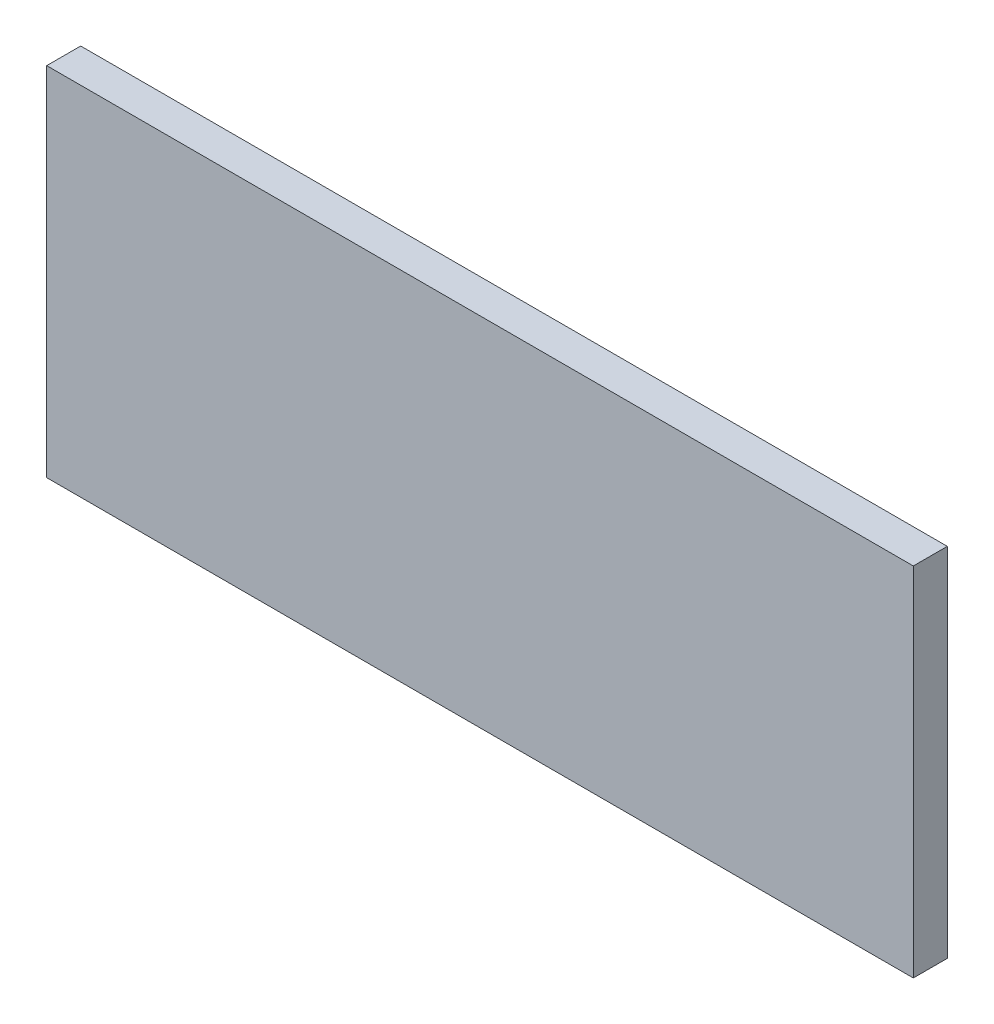
ISO-10303-21;
HEADER;
FILE_DESCRIPTION(('STEP AP214'),'2;1');
FILE_NAME('part.step','',(''),(''),'','','');
FILE_SCHEMA(('AUTOMOTIVE_DESIGN { 1 0 10303 214 1 1 1 1 }'));
ENDSEC;
DATA;
#1=APPLICATION_CONTEXT('core data for automotive mechanical design processes');
#2=APPLICATION_PROTOCOL_DEFINITION('international standard','automotive_design',2000,#1);
#3=PRODUCT_CONTEXT('',#1,'mechanical');
#4=PRODUCT('Part','Part','',(#3));
#5=PRODUCT_RELATED_PRODUCT_CATEGORY('part','',(#4));
#6=PRODUCT_DEFINITION_FORMATION('','',#4);
#7=PRODUCT_DEFINITION_CONTEXT('part definition',#1,'design');
#8=PRODUCT_DEFINITION('design','',#6,#7);
#9=PRODUCT_DEFINITION_SHAPE('','',#8);
#10=(LENGTH_UNIT() NAMED_UNIT(*) SI_UNIT(.MILLI.,.METRE.));
#11=(NAMED_UNIT(*) PLANE_ANGLE_UNIT() SI_UNIT($,.RADIAN.));
#12=(NAMED_UNIT(*) SI_UNIT($,.STERADIAN.) SOLID_ANGLE_UNIT());
#13=UNCERTAINTY_MEASURE_WITH_UNIT(LENGTH_MEASURE(1.E-05),#10,'distance_accuracy_value','');
#14=(GEOMETRIC_REPRESENTATION_CONTEXT(3) GLOBAL_UNCERTAINTY_ASSIGNED_CONTEXT((#13)) GLOBAL_UNIT_ASSIGNED_CONTEXT((#10,
#11,#12)) REPRESENTATION_CONTEXT('',''));
#15=CARTESIAN_POINT('',(0.,0.,0.));
#16=DIRECTION('',(0.,0.,1.));
#17=DIRECTION('',(1.,0.,0.));
#18=AXIS2_PLACEMENT_3D('',#15,#16,#17);
#19=CARTESIAN_POINT('',(51.,21.,4.));
#20=DIRECTION('',(-1.,0.,0.));
#21=DIRECTION('',(0.,-1.,0.));
#22=AXIS2_PLACEMENT_3D('',#19,#20,#21);
#23=PLANE('',#22);
#24=DIRECTION('',(0.,1.,0.));
#25=VECTOR('',#24,1.);
#26=CARTESIAN_POINT('',(51.,21.,0.));
#27=LINE('',#26,#25);
#28=CARTESIAN_POINT('',(51.,-21.,0.));
#29=VERTEX_POINT('',#28);
#30=CARTESIAN_POINT('',(51.,21.,0.));
#31=VERTEX_POINT('',#30);
#32=EDGE_CURVE('E96',#29,#31,#27,.T.);
#33=ORIENTED_EDGE('',*,*,#32,.T.);
#34=DIRECTION('',(0.,0.,-1.));
#35=VECTOR('',#34,1.);
#36=CARTESIAN_POINT('',(51.,21.,4.));
#37=LINE('',#36,#35);
#38=CARTESIAN_POINT('',(51.,21.,4.));
#39=VERTEX_POINT('',#38);
#40=EDGE_CURVE('E11',#39,#31,#37,.T.);
#41=ORIENTED_EDGE('',*,*,#40,.F.);
#42=DIRECTION('',(0.,1.,0.));
#43=VECTOR('',#42,1.);
#44=CARTESIAN_POINT('',(51.,21.,4.));
#45=LINE('',#44,#43);
#46=CARTESIAN_POINT('',(51.,-21.,4.));
#47=VERTEX_POINT('',#46);
#48=EDGE_CURVE('E84',#47,#39,#45,.T.);
#49=ORIENTED_EDGE('',*,*,#48,.F.);
#50=DIRECTION('',(0.,0.,-1.));
#51=VECTOR('',#50,1.);
#52=CARTESIAN_POINT('',(51.,-21.,4.));
#53=LINE('',#52,#51);
#54=EDGE_CURVE('E92',#47,#29,#53,.T.);
#55=ORIENTED_EDGE('',*,*,#54,.T.);
#56=EDGE_LOOP('',(#33,#41,#49,#55));
#57=FACE_BOUND('',#56,.T.);
#58=ADVANCED_FACE('F33',(#57),#23,.F.);
#59=CARTESIAN_POINT('',(-51.,21.,4.));
#60=DIRECTION('',(0.,-1.,0.));
#61=DIRECTION('',(0.,0.,-1.));
#62=AXIS2_PLACEMENT_3D('',#59,#60,#61);
#63=PLANE('',#62);
#64=DIRECTION('',(-1.,0.,0.));
#65=VECTOR('',#64,1.);
#66=CARTESIAN_POINT('',(-51.,21.,0.));
#67=LINE('',#66,#65);
#68=CARTESIAN_POINT('',(-51.,21.,0.));
#69=VERTEX_POINT('',#68);
#70=EDGE_CURVE('E88',#31,#69,#67,.T.);
#71=ORIENTED_EDGE('',*,*,#70,.T.);
#72=DIRECTION('',(0.,0.,-1.));
#73=VECTOR('',#72,1.);
#74=CARTESIAN_POINT('',(-51.,21.,4.));
#75=LINE('',#74,#73);
#76=CARTESIAN_POINT('',(-51.,21.,4.));
#77=VERTEX_POINT('',#76);
#78=EDGE_CURVE('E41',#77,#69,#75,.T.);
#79=ORIENTED_EDGE('',*,*,#78,.F.);
#80=DIRECTION('',(-1.,0.,0.));
#81=VECTOR('',#80,1.);
#82=CARTESIAN_POINT('',(-51.,21.,4.));
#83=LINE('',#82,#81);
#84=EDGE_CURVE('E79',#39,#77,#83,.T.);
#85=ORIENTED_EDGE('',*,*,#84,.F.);
#86=ORIENTED_EDGE('',*,*,#40,.T.);
#87=EDGE_LOOP('',(#71,#79,#85,#86));
#88=FACE_BOUND('',#87,.T.);
#89=ADVANCED_FACE('F87',(#88),#63,.F.);
#90=CARTESIAN_POINT('',(-51.,21.,4.));
#91=DIRECTION('',(1.,0.,0.));
#92=DIRECTION('',(0.,1.,0.));
#93=AXIS2_PLACEMENT_3D('',#90,#91,#92);
#94=PLANE('',#93);
#95=DIRECTION('',(0.,-1.,0.));
#96=VECTOR('',#95,1.);
#97=CARTESIAN_POINT('',(-51.,21.,0.));
#98=LINE('',#97,#96);
#99=CARTESIAN_POINT('',(-51.,-21.,0.));
#100=VERTEX_POINT('',#99);
#101=EDGE_CURVE('E66',#69,#100,#98,.T.);
#102=ORIENTED_EDGE('',*,*,#101,.T.);
#103=DIRECTION('',(0.,0.,-1.));
#104=VECTOR('',#103,1.);
#105=CARTESIAN_POINT('',(-51.,-21.,4.));
#106=LINE('',#105,#104);
#107=CARTESIAN_POINT('',(-51.,-21.,4.));
#108=VERTEX_POINT('',#107);
#109=EDGE_CURVE('E89',#108,#100,#106,.T.);
#110=ORIENTED_EDGE('',*,*,#109,.F.);
#111=DIRECTION('',(0.,-1.,0.));
#112=VECTOR('',#111,1.);
#113=CARTESIAN_POINT('',(-51.,21.,4.));
#114=LINE('',#113,#112);
#115=EDGE_CURVE('E82',#77,#108,#114,.T.);
#116=ORIENTED_EDGE('',*,*,#115,.F.);
#117=ORIENTED_EDGE('',*,*,#78,.T.);
#118=EDGE_LOOP('',(#102,#110,#116,#117));
#119=FACE_BOUND('',#118,.T.);
#120=ADVANCED_FACE('F90',(#119),#94,.F.);
#121=CARTESIAN_POINT('',(-51.,-21.,4.));
#122=DIRECTION('',(0.,1.,0.));
#123=DIRECTION('',(0.,0.,1.));
#124=AXIS2_PLACEMENT_3D('',#121,#122,#123);
#125=PLANE('',#124);
#126=DIRECTION('',(1.,0.,0.));
#127=VECTOR('',#126,1.);
#128=CARTESIAN_POINT('',(-51.,-21.,0.));
#129=LINE('',#128,#127);
#130=EDGE_CURVE('E72',#100,#29,#129,.T.);
#131=ORIENTED_EDGE('',*,*,#130,.T.);
#132=ORIENTED_EDGE('',*,*,#54,.F.);
#133=DIRECTION('',(1.,0.,0.));
#134=VECTOR('',#133,1.);
#135=CARTESIAN_POINT('',(-51.,-21.,4.));
#136=LINE('',#135,#134);
#137=EDGE_CURVE('E49',#108,#47,#136,.T.);
#138=ORIENTED_EDGE('',*,*,#137,.F.);
#139=ORIENTED_EDGE('',*,*,#109,.T.);
#140=EDGE_LOOP('',(#131,#132,#138,#139));
#141=FACE_BOUND('',#140,.T.);
#142=ADVANCED_FACE('F103',(#141),#125,.F.);
#143=CARTESIAN_POINT('',(0.,0.,4.));
#144=DIRECTION('',(0.,0.,1.));
#145=DIRECTION('',(1.,0.,0.));
#146=AXIS2_PLACEMENT_3D('',#143,#144,#145);
#147=PLANE('',#146);
#148=ORIENTED_EDGE('',*,*,#48,.T.);
#149=ORIENTED_EDGE('',*,*,#84,.T.);
#150=ORIENTED_EDGE('',*,*,#115,.T.);
#151=ORIENTED_EDGE('',*,*,#137,.T.);
#152=EDGE_LOOP('',(#148,#149,#150,#151));
#153=FACE_BOUND('',#152,.T.);
#154=ADVANCED_FACE('F80',(#153),#147,.T.);
#155=CARTESIAN_POINT('',(0.,0.,0.));
#156=DIRECTION('',(0.,0.,1.));
#157=DIRECTION('',(1.,0.,0.));
#158=AXIS2_PLACEMENT_3D('',#155,#156,#157);
#159=PLANE('',#158);
#160=ORIENTED_EDGE('',*,*,#32,.F.);
#161=ORIENTED_EDGE('',*,*,#130,.F.);
#162=ORIENTED_EDGE('',*,*,#101,.F.);
#163=ORIENTED_EDGE('',*,*,#70,.F.);
#164=EDGE_LOOP('',(#160,#161,#162,#163));
#165=FACE_BOUND('',#164,.T.);
#166=ADVANCED_FACE('F106',(#165),#159,.F.);
#167=CLOSED_SHELL('',(#58,#89,#120,#142,#154,#166));
#168=MANIFOLD_SOLID_BREP('B2',#167);
#169=ADVANCED_BREP_SHAPE_REPRESENTATION('',(#18,#168),#14);
#170=SHAPE_DEFINITION_REPRESENTATION(#9,#169);
ENDSEC;
END-ISO-10303-21;
